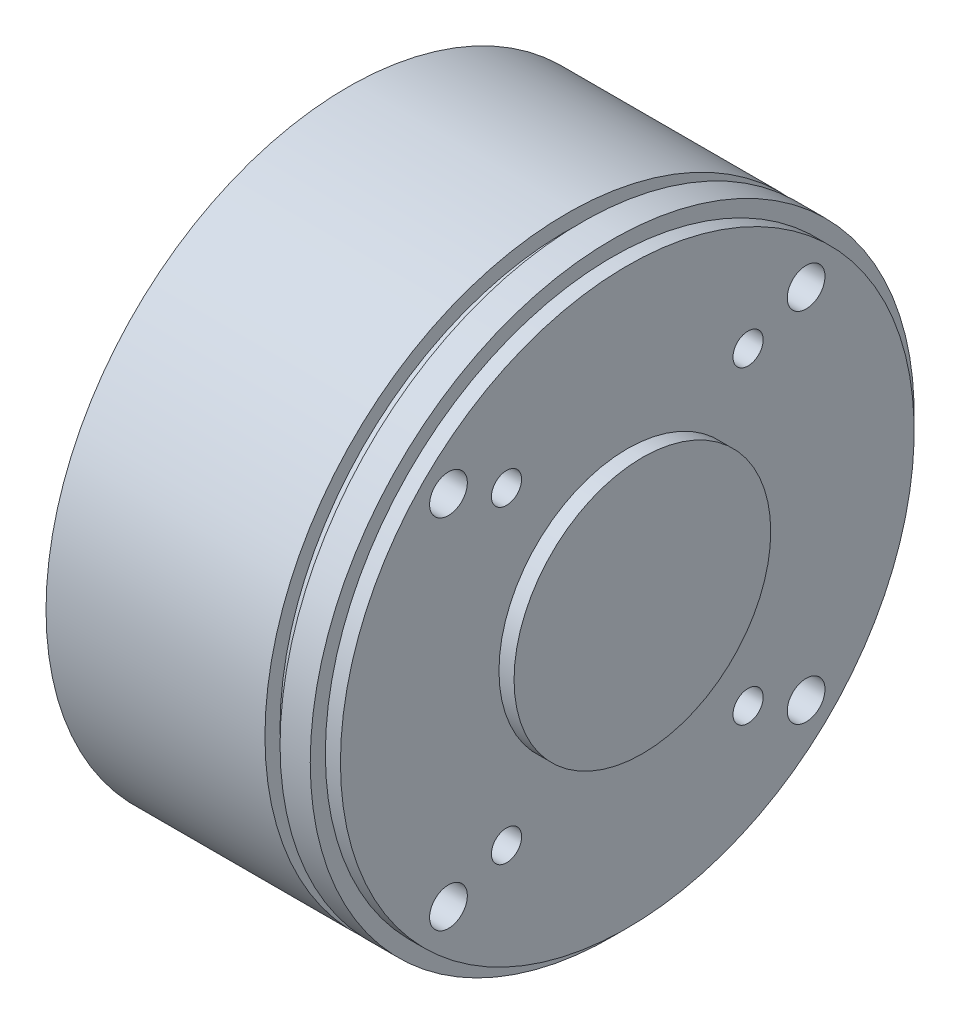
ISO-10303-21;
HEADER;
FILE_DESCRIPTION(('STEP AP214'),'2;1');
FILE_NAME('part.step','',(''),(''),'','','');
FILE_SCHEMA(('AUTOMOTIVE_DESIGN { 1 0 10303 214 1 1 1 1 }'));
ENDSEC;
DATA;
#1=APPLICATION_CONTEXT('core data for automotive mechanical design processes');
#2=APPLICATION_PROTOCOL_DEFINITION('international standard','automotive_design',2000,#1);
#3=PRODUCT_CONTEXT('',#1,'mechanical');
#4=PRODUCT('Part','Part','',(#3));
#5=PRODUCT_RELATED_PRODUCT_CATEGORY('part','',(#4));
#6=PRODUCT_DEFINITION_FORMATION('','',#4);
#7=PRODUCT_DEFINITION_CONTEXT('part definition',#1,'design');
#8=PRODUCT_DEFINITION('design','',#6,#7);
#9=PRODUCT_DEFINITION_SHAPE('','',#8);
#10=(LENGTH_UNIT() NAMED_UNIT(*) SI_UNIT(.MILLI.,.METRE.));
#11=(NAMED_UNIT(*) PLANE_ANGLE_UNIT() SI_UNIT($,.RADIAN.));
#12=(NAMED_UNIT(*) SI_UNIT($,.STERADIAN.) SOLID_ANGLE_UNIT());
#13=UNCERTAINTY_MEASURE_WITH_UNIT(LENGTH_MEASURE(1.E-05),#10,'distance_accuracy_value','');
#14=(GEOMETRIC_REPRESENTATION_CONTEXT(3) GLOBAL_UNCERTAINTY_ASSIGNED_CONTEXT((#13)) GLOBAL_UNIT_ASSIGNED_CONTEXT((#10,
#11,#12)) REPRESENTATION_CONTEXT('',''));
#15=CARTESIAN_POINT('',(0.,0.,0.));
#16=DIRECTION('',(0.,0.,1.));
#17=DIRECTION('',(1.,0.,0.));
#18=AXIS2_PLACEMENT_3D('',#15,#16,#17);
#19=CARTESIAN_POINT('',(-15.,0.,-15.));
#20=DIRECTION('',(1.,0.,0.));
#21=DIRECTION('',(0.,0.,-1.));
#22=AXIS2_PLACEMENT_3D('',#19,#20,#21);
#23=PLANE('',#22);
#24=CARTESIAN_POINT('',(-15.,10.,0.));
#25=DIRECTION('',(-1.,0.,0.));
#26=DIRECTION('',(0.,0.,1.));
#27=AXIS2_PLACEMENT_3D('',#24,#25,#26);
#28=CIRCLE('',#27,1.5);
#29=CARTESIAN_POINT('',(-15.,10.,1.5));
#30=VERTEX_POINT('',#29);
#31=EDGE_CURVE('E192',#30,#30,#28,.T.);
#32=ORIENTED_EDGE('',*,*,#31,.F.);
#33=EDGE_LOOP('',(#32));
#34=FACE_BOUND('',#33,.T.);
#35=CARTESIAN_POINT('',(-15.,0.,10.));
#36=DIRECTION('',(-1.,0.,0.));
#37=DIRECTION('',(0.,0.,1.));
#38=AXIS2_PLACEMENT_3D('',#35,#36,#37);
#39=CIRCLE('',#38,1.5);
#40=CARTESIAN_POINT('',(-15.,0.,11.5));
#41=VERTEX_POINT('',#40);
#42=EDGE_CURVE('E196',#41,#41,#39,.T.);
#43=ORIENTED_EDGE('',*,*,#42,.F.);
#44=EDGE_LOOP('',(#43));
#45=FACE_BOUND('',#44,.T.);
#46=CARTESIAN_POINT('',(-15.,-10.,5.66321487883075E-13));
#47=DIRECTION('',(-1.,0.,0.));
#48=DIRECTION('',(0.,0.,1.));
#49=AXIS2_PLACEMENT_3D('',#46,#47,#48);
#50=CIRCLE('',#49,1.50000000000061);
#51=CARTESIAN_POINT('',(-15.,-10.,1.50000000000118));
#52=VERTEX_POINT('',#51);
#53=EDGE_CURVE('E84',#52,#52,#50,.T.);
#54=ORIENTED_EDGE('',*,*,#53,.F.);
#55=EDGE_LOOP('',(#54));
#56=FACE_BOUND('',#55,.T.);
#57=CARTESIAN_POINT('',(-15.,1.06305679837731E-13,-10.));
#58=DIRECTION('',(-1.,0.,0.));
#59=DIRECTION('',(0.,0.,1.));
#60=AXIS2_PLACEMENT_3D('',#57,#58,#59);
#61=CIRCLE('',#60,1.5);
#62=CARTESIAN_POINT('',(-15.,1.06305679837731E-13,-8.5));
#63=VERTEX_POINT('',#62);
#64=EDGE_CURVE('E75',#63,#63,#61,.T.);
#65=ORIENTED_EDGE('',*,*,#64,.F.);
#66=EDGE_LOOP('',(#65));
#67=FACE_BOUND('',#66,.T.);
#68=CARTESIAN_POINT('',(-15.,0.,0.));
#69=DIRECTION('',(-1.,0.,0.));
#70=DIRECTION('',(0.,0.,1.));
#71=AXIS2_PLACEMENT_3D('',#68,#69,#70);
#72=CIRCLE('',#71,15.);
#73=CARTESIAN_POINT('',(-15.,0.,15.));
#74=VERTEX_POINT('',#73);
#75=EDGE_CURVE('E43',#74,#74,#72,.T.);
#76=ORIENTED_EDGE('',*,*,#75,.T.);
#77=EDGE_LOOP('',(#76));
#78=FACE_BOUND('',#77,.T.);
#79=ADVANCED_FACE('F34',(#34,#45,#56,#67,#78),#23,.F.);
#80=CARTESIAN_POINT('',(-14.5,0.,-20.));
#81=DIRECTION('',(1.,0.,0.));
#82=DIRECTION('',(0.,0.,-1.));
#83=AXIS2_PLACEMENT_3D('',#80,#81,#82);
#84=PLANE('',#83);
#85=CARTESIAN_POINT('',(-14.5,0.,0.));
#86=DIRECTION('',(1.,0.,0.));
#87=DIRECTION('',(0.,0.,-1.));
#88=AXIS2_PLACEMENT_3D('',#85,#86,#87);
#89=CIRCLE('',#88,15.5);
#90=CARTESIAN_POINT('',(-14.5,0.,-15.5));
#91=VERTEX_POINT('',#90);
#92=EDGE_CURVE('E10',#91,#91,#89,.T.);
#93=ORIENTED_EDGE('',*,*,#92,.T.);
#94=EDGE_LOOP('',(#93));
#95=FACE_BOUND('',#94,.T.);
#96=CARTESIAN_POINT('',(-14.5,0.,0.));
#97=DIRECTION('',(-1.,0.,0.));
#98=DIRECTION('',(0.,0.,1.));
#99=AXIS2_PLACEMENT_3D('',#96,#97,#98);
#100=CIRCLE('',#99,20.);
#101=CARTESIAN_POINT('',(-14.5,0.,20.));
#102=VERTEX_POINT('',#101);
#103=EDGE_CURVE('E48',#102,#102,#100,.T.);
#104=ORIENTED_EDGE('',*,*,#103,.T.);
#105=EDGE_LOOP('',(#104));
#106=FACE_BOUND('',#105,.T.);
#107=ADVANCED_FACE('F118',(#95,#106),#84,.F.);
#108=CARTESIAN_POINT('',(-9.64640688418887,0.,0.));
#109=DIRECTION('',(-1.,0.,0.));
#110=DIRECTION('',(0.,0.,1.));
#111=AXIS2_PLACEMENT_3D('',#108,#109,#110);
#112=CYLINDRICAL_SURFACE('',#111,20.);
#113=ORIENTED_EDGE('',*,*,#103,.F.);
#114=EDGE_LOOP('',(#113));
#115=FACE_BOUND('',#114,.T.);
#116=CARTESIAN_POINT('',(0.,0.,0.));
#117=DIRECTION('',(-1.,0.,0.));
#118=DIRECTION('',(0.,0.,1.));
#119=AXIS2_PLACEMENT_3D('',#116,#117,#118);
#120=CIRCLE('',#119,20.);
#121=CARTESIAN_POINT('',(0.,0.,20.));
#122=VERTEX_POINT('',#121);
#123=EDGE_CURVE('E113',#122,#122,#120,.T.);
#124=ORIENTED_EDGE('',*,*,#123,.T.);
#125=EDGE_LOOP('',(#124));
#126=FACE_BOUND('',#125,.T.);
#127=ADVANCED_FACE('F120',(#115,#126),#112,.T.);
#128=CARTESIAN_POINT('',(0.,0.,-19.));
#129=DIRECTION('',(-1.,0.,0.));
#130=DIRECTION('',(0.,0.,1.));
#131=AXIS2_PLACEMENT_3D('',#128,#129,#130);
#132=PLANE('',#131);
#133=ORIENTED_EDGE('',*,*,#123,.F.);
#134=EDGE_LOOP('',(#133));
#135=FACE_BOUND('',#134,.T.);
#136=CARTESIAN_POINT('',(0.,0.,0.));
#137=DIRECTION('',(-1.,0.,0.));
#138=DIRECTION('',(0.,0.,1.));
#139=AXIS2_PLACEMENT_3D('',#136,#137,#138);
#140=CIRCLE('',#139,19.);
#141=CARTESIAN_POINT('',(0.,0.,19.));
#142=VERTEX_POINT('',#141);
#143=EDGE_CURVE('E110',#142,#142,#140,.T.);
#144=ORIENTED_EDGE('',*,*,#143,.T.);
#145=EDGE_LOOP('',(#144));
#146=FACE_BOUND('',#145,.T.);
#147=ADVANCED_FACE('F123',(#135,#146),#132,.F.);
#148=CARTESIAN_POINT('',(-9.64640688418887,0.,0.));
#149=DIRECTION('',(-1.,0.,0.));
#150=DIRECTION('',(0.,0.,1.));
#151=AXIS2_PLACEMENT_3D('',#148,#149,#150);
#152=CYLINDRICAL_SURFACE('',#151,19.);
#153=ORIENTED_EDGE('',*,*,#143,.F.);
#154=EDGE_LOOP('',(#153));
#155=FACE_BOUND('',#154,.T.);
#156=CARTESIAN_POINT('',(0.999999999999999,0.,0.));
#157=DIRECTION('',(-1.,0.,0.));
#158=DIRECTION('',(0.,0.,1.));
#159=AXIS2_PLACEMENT_3D('',#156,#157,#158);
#160=CIRCLE('',#159,19.);
#161=CARTESIAN_POINT('',(0.999999999999999,0.,19.));
#162=VERTEX_POINT('',#161);
#163=EDGE_CURVE('E107',#162,#162,#160,.T.);
#164=ORIENTED_EDGE('',*,*,#163,.T.);
#165=EDGE_LOOP('',(#164));
#166=FACE_BOUND('',#165,.T.);
#167=ADVANCED_FACE('F129',(#155,#166),#152,.T.);
#168=CARTESIAN_POINT('',(1.,0.,-19.));
#169=DIRECTION('',(1.,0.,0.));
#170=DIRECTION('',(0.,0.,-1.));
#171=AXIS2_PLACEMENT_3D('',#168,#169,#170);
#172=PLANE('',#171);
#173=ORIENTED_EDGE('',*,*,#163,.F.);
#174=EDGE_LOOP('',(#173));
#175=FACE_BOUND('',#174,.T.);
#176=CARTESIAN_POINT('',(0.999999999999999,0.,0.));
#177=DIRECTION('',(-1.,0.,0.));
#178=DIRECTION('',(0.,0.,1.));
#179=AXIS2_PLACEMENT_3D('',#176,#177,#178);
#180=CIRCLE('',#179,20.);
#181=CARTESIAN_POINT('',(0.999999999999999,0.,20.));
#182=VERTEX_POINT('',#181);
#183=EDGE_CURVE('E104',#182,#182,#180,.T.);
#184=ORIENTED_EDGE('',*,*,#183,.T.);
#185=EDGE_LOOP('',(#184));
#186=FACE_BOUND('',#185,.T.);
#187=ADVANCED_FACE('F135',(#175,#186),#172,.F.);
#188=CARTESIAN_POINT('',(-9.64640688418887,0.,0.));
#189=DIRECTION('',(-1.,0.,0.));
#190=DIRECTION('',(0.,0.,1.));
#191=AXIS2_PLACEMENT_3D('',#188,#189,#190);
#192=CYLINDRICAL_SURFACE('',#191,20.);
#193=ORIENTED_EDGE('',*,*,#183,.F.);
#194=EDGE_LOOP('',(#193));
#195=FACE_BOUND('',#194,.T.);
#196=CARTESIAN_POINT('',(3.,0.,0.));
#197=DIRECTION('',(-1.,0.,0.));
#198=DIRECTION('',(0.,0.,1.));
#199=AXIS2_PLACEMENT_3D('',#196,#197,#198);
#200=CIRCLE('',#199,20.);
#201=CARTESIAN_POINT('',(3.,0.,20.));
#202=VERTEX_POINT('',#201);
#203=EDGE_CURVE('E101',#202,#202,#200,.T.);
#204=ORIENTED_EDGE('',*,*,#203,.T.);
#205=EDGE_LOOP('',(#204));
#206=FACE_BOUND('',#205,.T.);
#207=ADVANCED_FACE('F141',(#195,#206),#192,.T.);
#208=CARTESIAN_POINT('',(3.,0.,-20.));
#209=DIRECTION('',(-1.,0.,0.));
#210=DIRECTION('',(0.,0.,1.));
#211=AXIS2_PLACEMENT_3D('',#208,#209,#210);
#212=PLANE('',#211);
#213=ORIENTED_EDGE('',*,*,#203,.F.);
#214=EDGE_LOOP('',(#213));
#215=FACE_BOUND('',#214,.T.);
#216=CARTESIAN_POINT('',(3.,0.,0.));
#217=DIRECTION('',(-1.,0.,0.));
#218=DIRECTION('',(0.,0.,1.));
#219=AXIS2_PLACEMENT_3D('',#216,#217,#218);
#220=CIRCLE('',#219,19.);
#221=CARTESIAN_POINT('',(3.,0.,19.));
#222=VERTEX_POINT('',#221);
#223=EDGE_CURVE('E98',#222,#222,#220,.T.);
#224=ORIENTED_EDGE('',*,*,#223,.T.);
#225=EDGE_LOOP('',(#224));
#226=FACE_BOUND('',#225,.T.);
#227=ADVANCED_FACE('F147',(#215,#226),#212,.F.);
#228=CARTESIAN_POINT('',(-9.64640688418887,0.,0.));
#229=DIRECTION('',(-1.,0.,0.));
#230=DIRECTION('',(0.,0.,1.));
#231=AXIS2_PLACEMENT_3D('',#228,#229,#230);
#232=CYLINDRICAL_SURFACE('',#231,19.);
#233=ORIENTED_EDGE('',*,*,#223,.F.);
#234=EDGE_LOOP('',(#233));
#235=FACE_BOUND('',#234,.T.);
#236=CARTESIAN_POINT('',(4.,0.,0.));
#237=DIRECTION('',(-1.,0.,0.));
#238=DIRECTION('',(0.,0.,1.));
#239=AXIS2_PLACEMENT_3D('',#236,#237,#238);
#240=CIRCLE('',#239,19.);
#241=CARTESIAN_POINT('',(4.,0.,19.));
#242=VERTEX_POINT('',#241);
#243=EDGE_CURVE('E95',#242,#242,#240,.T.);
#244=ORIENTED_EDGE('',*,*,#243,.T.);
#245=EDGE_LOOP('',(#244));
#246=FACE_BOUND('',#245,.T.);
#247=ADVANCED_FACE('F153',(#235,#246),#232,.T.);
#248=CARTESIAN_POINT('',(4.,0.,-19.));
#249=DIRECTION('',(-1.,0.,0.));
#250=DIRECTION('',(0.,0.,1.));
#251=AXIS2_PLACEMENT_3D('',#248,#249,#250);
#252=PLANE('',#251);
#253=CARTESIAN_POINT('',(4.,10.25,-8.));
#254=DIRECTION('',(-1.,0.,0.));
#255=DIRECTION('',(0.,0.,1.));
#256=AXIS2_PLACEMENT_3D('',#253,#254,#255);
#257=CIRCLE('',#256,1.);
#258=CARTESIAN_POINT('',(4.,10.25,-7.));
#259=VERTEX_POINT('',#258);
#260=EDGE_CURVE('E39',#259,#259,#257,.T.);
#261=ORIENTED_EDGE('',*,*,#260,.T.);
#262=EDGE_LOOP('',(#261));
#263=FACE_BOUND('',#262,.T.);
#264=CARTESIAN_POINT('',(4.,-10.25,-8.00000000000001));
#265=DIRECTION('',(-1.,0.,0.));
#266=DIRECTION('',(0.,0.,1.));
#267=AXIS2_PLACEMENT_3D('',#264,#265,#266);
#268=CIRCLE('',#267,1.);
#269=CARTESIAN_POINT('',(4.,-10.25,-7.));
#270=VERTEX_POINT('',#269);
#271=EDGE_CURVE('E70',#270,#270,#268,.T.);
#272=ORIENTED_EDGE('',*,*,#271,.T.);
#273=EDGE_LOOP('',(#272));
#274=FACE_BOUND('',#273,.T.);
#275=CARTESIAN_POINT('',(4.,-10.25,8.));
#276=DIRECTION('',(-1.,0.,0.));
#277=DIRECTION('',(0.,0.,1.));
#278=AXIS2_PLACEMENT_3D('',#275,#276,#277);
#279=CIRCLE('',#278,1.);
#280=CARTESIAN_POINT('',(4.,-10.25,9.));
#281=VERTEX_POINT('',#280);
#282=EDGE_CURVE('E68',#281,#281,#279,.T.);
#283=ORIENTED_EDGE('',*,*,#282,.T.);
#284=EDGE_LOOP('',(#283));
#285=FACE_BOUND('',#284,.T.);
#286=CARTESIAN_POINT('',(4.,11.8440385848746,11.8440385848747));
#287=DIRECTION('',(-1.,0.,0.));
#288=DIRECTION('',(0.,0.,1.));
#289=AXIS2_PLACEMENT_3D('',#286,#287,#288);
#290=CIRCLE('',#289,1.25);
#291=CARTESIAN_POINT('',(4.,11.8440385848746,13.0940385848747));
#292=VERTEX_POINT('',#291);
#293=EDGE_CURVE('E65',#292,#292,#290,.T.);
#294=ORIENTED_EDGE('',*,*,#293,.T.);
#295=EDGE_LOOP('',(#294));
#296=FACE_BOUND('',#295,.T.);
#297=CARTESIAN_POINT('',(4.,11.8440385848754,-11.8440385848746));
#298=DIRECTION('',(-1.,0.,0.));
#299=DIRECTION('',(0.,0.,1.));
#300=AXIS2_PLACEMENT_3D('',#297,#298,#299);
#301=CIRCLE('',#300,1.25000000000068);
#302=CARTESIAN_POINT('',(4.,11.8440385848754,-10.5940385848739));
#303=VERTEX_POINT('',#302);
#304=EDGE_CURVE('E62',#303,#303,#301,.T.);
#305=ORIENTED_EDGE('',*,*,#304,.T.);
#306=EDGE_LOOP('',(#305));
#307=FACE_BOUND('',#306,.T.);
#308=CARTESIAN_POINT('',(4.,-11.8440385848739,-11.8440385848754));
#309=DIRECTION('',(-1.,0.,0.));
#310=DIRECTION('',(0.,0.,1.));
#311=AXIS2_PLACEMENT_3D('',#308,#309,#310);
#312=CIRCLE('',#311,1.25000000000093);
#313=CARTESIAN_POINT('',(4.,-11.8440385848739,-10.5940385848745));
#314=VERTEX_POINT('',#313);
#315=EDGE_CURVE('E59',#314,#314,#312,.T.);
#316=ORIENTED_EDGE('',*,*,#315,.T.);
#317=EDGE_LOOP('',(#316));
#318=FACE_BOUND('',#317,.T.);
#319=CARTESIAN_POINT('',(4.,-11.8440385848747,11.8440385848739));
#320=DIRECTION('',(-1.,0.,0.));
#321=DIRECTION('',(0.,0.,1.));
#322=AXIS2_PLACEMENT_3D('',#319,#320,#321);
#323=CIRCLE('',#322,1.25000000000035);
#324=CARTESIAN_POINT('',(4.,-11.8440385848747,13.0940385848743));
#325=VERTEX_POINT('',#324);
#326=EDGE_CURVE('E55',#325,#325,#323,.T.);
#327=ORIENTED_EDGE('',*,*,#326,.T.);
#328=EDGE_LOOP('',(#327));
#329=FACE_BOUND('',#328,.T.);
#330=CARTESIAN_POINT('',(4.,10.25,8.));
#331=DIRECTION('',(-1.,0.,0.));
#332=DIRECTION('',(0.,0.,1.));
#333=AXIS2_PLACEMENT_3D('',#330,#331,#332);
#334=CIRCLE('',#333,1.);
#335=CARTESIAN_POINT('',(4.,10.25,9.));
#336=VERTEX_POINT('',#335);
#337=EDGE_CURVE('E52',#336,#336,#334,.T.);
#338=ORIENTED_EDGE('',*,*,#337,.T.);
#339=EDGE_LOOP('',(#338));
#340=FACE_BOUND('',#339,.T.);
#341=ORIENTED_EDGE('',*,*,#243,.F.);
#342=EDGE_LOOP('',(#341));
#343=FACE_BOUND('',#342,.T.);
#344=CARTESIAN_POINT('',(4.,0.,0.));
#345=DIRECTION('',(-1.,0.,0.));
#346=DIRECTION('',(0.,0.,1.));
#347=AXIS2_PLACEMENT_3D('',#344,#345,#346);
#348=CIRCLE('',#347,8.5);
#349=CARTESIAN_POINT('',(4.,0.,8.5));
#350=VERTEX_POINT('',#349);
#351=EDGE_CURVE('E91',#350,#350,#348,.T.);
#352=ORIENTED_EDGE('',*,*,#351,.T.);
#353=EDGE_LOOP('',(#352));
#354=FACE_BOUND('',#353,.T.);
#355=ADVANCED_FACE('F159',(#263,#274,#285,#296,#307,#318,#329,#340,#343,#354),#252,.F.);
#356=CARTESIAN_POINT('',(-9.64640688418887,0.,0.));
#357=DIRECTION('',(-1.,0.,0.));
#358=DIRECTION('',(0.,0.,1.));
#359=AXIS2_PLACEMENT_3D('',#356,#357,#358);
#360=CYLINDRICAL_SURFACE('',#359,8.5);
#361=ORIENTED_EDGE('',*,*,#351,.F.);
#362=EDGE_LOOP('',(#361));
#363=FACE_BOUND('',#362,.T.);
#364=CARTESIAN_POINT('',(5.,0.,0.));
#365=DIRECTION('',(-1.,0.,0.));
#366=DIRECTION('',(0.,0.,1.));
#367=AXIS2_PLACEMENT_3D('',#364,#365,#366);
#368=CIRCLE('',#367,8.5);
#369=CARTESIAN_POINT('',(5.,0.,8.5));
#370=VERTEX_POINT('',#369);
#371=EDGE_CURVE('E88',#370,#370,#368,.T.);
#372=ORIENTED_EDGE('',*,*,#371,.T.);
#373=EDGE_LOOP('',(#372));
#374=FACE_BOUND('',#373,.T.);
#375=ADVANCED_FACE('F165',(#363,#374),#360,.T.);
#376=CARTESIAN_POINT('',(5.,0.,-8.5));
#377=DIRECTION('',(-1.,0.,0.));
#378=DIRECTION('',(0.,0.,1.));
#379=AXIS2_PLACEMENT_3D('',#376,#377,#378);
#380=PLANE('',#379);
#381=ORIENTED_EDGE('',*,*,#371,.F.);
#382=EDGE_LOOP('',(#381));
#383=FACE_BOUND('',#382,.T.);
#384=ADVANCED_FACE('F171',(#383),#380,.F.);
#385=CARTESIAN_POINT('',(-15.,0.,0.));
#386=DIRECTION('',(1.,0.,0.));
#387=DIRECTION('',(0.,0.,-1.));
#388=AXIS2_PLACEMENT_3D('',#385,#386,#387);
#389=CONICAL_SURFACE('',#388,15.,0.785398163397445);
#390=ORIENTED_EDGE('',*,*,#92,.F.);
#391=EDGE_LOOP('',(#390));
#392=FACE_BOUND('',#391,.T.);
#393=ORIENTED_EDGE('',*,*,#75,.F.);
#394=EDGE_LOOP('',(#393));
#395=FACE_BOUND('',#394,.T.);
#396=ADVANCED_FACE('F37',(#392,#395),#389,.T.);
#397=CARTESIAN_POINT('',(-10.,1.06305679837731E-13,-10.));
#398=DIRECTION('',(-1.,0.,0.));
#399=DIRECTION('',(0.,0.,1.));
#400=AXIS2_PLACEMENT_3D('',#397,#398,#399);
#401=CYLINDRICAL_SURFACE('',#400,1.5);
#402=CARTESIAN_POINT('',(-10.,1.06305679837731E-13,-10.));
#403=DIRECTION('',(-1.,0.,0.));
#404=DIRECTION('',(0.,0.,1.));
#405=AXIS2_PLACEMENT_3D('',#402,#403,#404);
#406=CIRCLE('',#405,1.5);
#407=CARTESIAN_POINT('',(-10.,1.06305679837731E-13,-8.5));
#408=VERTEX_POINT('',#407);
#409=EDGE_CURVE('E79',#408,#408,#406,.T.);
#410=ORIENTED_EDGE('',*,*,#409,.F.);
#411=EDGE_LOOP('',(#410));
#412=FACE_BOUND('',#411,.T.);
#413=ORIENTED_EDGE('',*,*,#64,.T.);
#414=EDGE_LOOP('',(#413));
#415=FACE_BOUND('',#414,.T.);
#416=ADVANCED_FACE('F180',(#412,#415),#401,.F.);
#417=CARTESIAN_POINT('',(-10.,1.06305679837731E-13,-10.));
#418=DIRECTION('',(-1.,0.,0.));
#419=DIRECTION('',(0.,0.,1.));
#420=AXIS2_PLACEMENT_3D('',#417,#418,#419);
#421=PLANE('',#420);
#422=ORIENTED_EDGE('',*,*,#409,.T.);
#423=EDGE_LOOP('',(#422));
#424=FACE_BOUND('',#423,.T.);
#425=ADVANCED_FACE('F292',(#424),#421,.T.);
#426=CARTESIAN_POINT('',(-10.,-10.,5.66321487883075E-13));
#427=DIRECTION('',(-1.,0.,0.));
#428=DIRECTION('',(0.,0.,1.));
#429=AXIS2_PLACEMENT_3D('',#426,#427,#428);
#430=CYLINDRICAL_SURFACE('',#429,1.50000000000061);
#431=CARTESIAN_POINT('',(-10.,-10.,5.66321487883075E-13));
#432=DIRECTION('',(-1.,0.,0.));
#433=DIRECTION('',(0.,0.,1.));
#434=AXIS2_PLACEMENT_3D('',#431,#432,#433);
#435=CIRCLE('',#434,1.50000000000061);
#436=CARTESIAN_POINT('',(-10.,-10.,1.50000000000118));
#437=VERTEX_POINT('',#436);
#438=EDGE_CURVE('E204',#437,#437,#435,.T.);
#439=ORIENTED_EDGE('',*,*,#438,.F.);
#440=EDGE_LOOP('',(#439));
#441=FACE_BOUND('',#440,.T.);
#442=ORIENTED_EDGE('',*,*,#53,.T.);
#443=EDGE_LOOP('',(#442));
#444=FACE_BOUND('',#443,.T.);
#445=ADVANCED_FACE('F288',(#441,#444),#430,.F.);
#446=CARTESIAN_POINT('',(-10.,-10.,5.66321487883075E-13));
#447=DIRECTION('',(-1.,0.,0.));
#448=DIRECTION('',(0.,0.,1.));
#449=AXIS2_PLACEMENT_3D('',#446,#447,#448);
#450=PLANE('',#449);
#451=ORIENTED_EDGE('',*,*,#438,.T.);
#452=EDGE_LOOP('',(#451));
#453=FACE_BOUND('',#452,.T.);
#454=ADVANCED_FACE('F284',(#453),#450,.T.);
#455=CARTESIAN_POINT('',(-10.,0.,10.));
#456=DIRECTION('',(-1.,0.,0.));
#457=DIRECTION('',(0.,0.,1.));
#458=AXIS2_PLACEMENT_3D('',#455,#456,#457);
#459=CYLINDRICAL_SURFACE('',#458,1.5);
#460=CARTESIAN_POINT('',(-10.,0.,10.));
#461=DIRECTION('',(-1.,0.,0.));
#462=DIRECTION('',(0.,0.,1.));
#463=AXIS2_PLACEMENT_3D('',#460,#461,#462);
#464=CIRCLE('',#463,1.5);
#465=CARTESIAN_POINT('',(-10.,0.,11.5));
#466=VERTEX_POINT('',#465);
#467=EDGE_CURVE('E209',#466,#466,#464,.T.);
#468=ORIENTED_EDGE('',*,*,#467,.F.);
#469=EDGE_LOOP('',(#468));
#470=FACE_BOUND('',#469,.T.);
#471=ORIENTED_EDGE('',*,*,#42,.T.);
#472=EDGE_LOOP('',(#471));
#473=FACE_BOUND('',#472,.T.);
#474=ADVANCED_FACE('F280',(#470,#473),#459,.F.);
#475=CARTESIAN_POINT('',(-10.,0.,10.));
#476=DIRECTION('',(-1.,0.,0.));
#477=DIRECTION('',(0.,0.,1.));
#478=AXIS2_PLACEMENT_3D('',#475,#476,#477);
#479=PLANE('',#478);
#480=ORIENTED_EDGE('',*,*,#467,.T.);
#481=EDGE_LOOP('',(#480));
#482=FACE_BOUND('',#481,.T.);
#483=ADVANCED_FACE('F276',(#482),#479,.T.);
#484=CARTESIAN_POINT('',(-10.,10.,0.));
#485=DIRECTION('',(-1.,0.,0.));
#486=DIRECTION('',(0.,0.,1.));
#487=AXIS2_PLACEMENT_3D('',#484,#485,#486);
#488=CYLINDRICAL_SURFACE('',#487,1.5);
#489=CARTESIAN_POINT('',(-10.,10.,0.));
#490=DIRECTION('',(-1.,0.,0.));
#491=DIRECTION('',(0.,0.,1.));
#492=AXIS2_PLACEMENT_3D('',#489,#490,#491);
#493=CIRCLE('',#492,1.5);
#494=CARTESIAN_POINT('',(-10.,10.,1.5));
#495=VERTEX_POINT('',#494);
#496=EDGE_CURVE('E92',#495,#495,#493,.T.);
#497=ORIENTED_EDGE('',*,*,#496,.F.);
#498=EDGE_LOOP('',(#497));
#499=FACE_BOUND('',#498,.T.);
#500=ORIENTED_EDGE('',*,*,#31,.T.);
#501=EDGE_LOOP('',(#500));
#502=FACE_BOUND('',#501,.T.);
#503=ADVANCED_FACE('F268',(#499,#502),#488,.F.);
#504=CARTESIAN_POINT('',(-10.,10.,0.));
#505=DIRECTION('',(-1.,0.,0.));
#506=DIRECTION('',(0.,0.,1.));
#507=AXIS2_PLACEMENT_3D('',#504,#505,#506);
#508=PLANE('',#507);
#509=ORIENTED_EDGE('',*,*,#496,.T.);
#510=EDGE_LOOP('',(#509));
#511=FACE_BOUND('',#510,.T.);
#512=ADVANCED_FACE('F258',(#511),#508,.T.);
#513=CARTESIAN_POINT('',(0.,10.25,8.));
#514=DIRECTION('',(1.,0.,0.));
#515=DIRECTION('',(0.,0.,-1.));
#516=AXIS2_PLACEMENT_3D('',#513,#514,#515);
#517=CYLINDRICAL_SURFACE('',#516,1.);
#518=CARTESIAN_POINT('',(0.,10.25,8.));
#519=DIRECTION('',(1.,0.,0.));
#520=DIRECTION('',(0.,0.,-1.));
#521=AXIS2_PLACEMENT_3D('',#518,#519,#520);
#522=CIRCLE('',#521,1.);
#523=CARTESIAN_POINT('',(0.,10.25,7.));
#524=VERTEX_POINT('',#523);
#525=EDGE_CURVE('E56',#524,#524,#522,.T.);
#526=ORIENTED_EDGE('',*,*,#525,.F.);
#527=EDGE_LOOP('',(#526));
#528=FACE_BOUND('',#527,.T.);
#529=ORIENTED_EDGE('',*,*,#337,.F.);
#530=EDGE_LOOP('',(#529));
#531=FACE_BOUND('',#530,.T.);
#532=ADVANCED_FACE('F255',(#528,#531),#517,.F.);
#533=CARTESIAN_POINT('',(0.,10.25,8.));
#534=DIRECTION('',(1.,0.,0.));
#535=DIRECTION('',(0.,0.,-1.));
#536=AXIS2_PLACEMENT_3D('',#533,#534,#535);
#537=PLANE('',#536);
#538=ORIENTED_EDGE('',*,*,#525,.T.);
#539=EDGE_LOOP('',(#538));
#540=FACE_BOUND('',#539,.T.);
#541=ADVANCED_FACE('F257',(#540),#537,.T.);
#542=CARTESIAN_POINT('',(0.,-11.8440385848747,11.8440385848739));
#543=DIRECTION('',(1.,0.,0.));
#544=DIRECTION('',(0.,0.,-1.));
#545=AXIS2_PLACEMENT_3D('',#542,#543,#544);
#546=CYLINDRICAL_SURFACE('',#545,1.25000000000035);
#547=CARTESIAN_POINT('',(0.,-11.8440385848747,11.8440385848739));
#548=DIRECTION('',(1.,0.,0.));
#549=DIRECTION('',(0.,0.,-1.));
#550=AXIS2_PLACEMENT_3D('',#547,#548,#549);
#551=CIRCLE('',#550,1.25000000000035);
#552=CARTESIAN_POINT('',(0.,-11.8440385848747,10.5940385848736));
#553=VERTEX_POINT('',#552);
#554=EDGE_CURVE('E230',#553,#553,#551,.T.);
#555=ORIENTED_EDGE('',*,*,#554,.F.);
#556=EDGE_LOOP('',(#555));
#557=FACE_BOUND('',#556,.T.);
#558=ORIENTED_EDGE('',*,*,#326,.F.);
#559=EDGE_LOOP('',(#558));
#560=FACE_BOUND('',#559,.T.);
#561=ADVANCED_FACE('F265',(#557,#560),#546,.F.);
#562=CARTESIAN_POINT('',(0.,-11.8440385848747,11.8440385848739));
#563=DIRECTION('',(1.,0.,0.));
#564=DIRECTION('',(0.,0.,-1.));
#565=AXIS2_PLACEMENT_3D('',#562,#563,#564);
#566=PLANE('',#565);
#567=ORIENTED_EDGE('',*,*,#554,.T.);
#568=EDGE_LOOP('',(#567));
#569=FACE_BOUND('',#568,.T.);
#570=ADVANCED_FACE('F358',(#569),#566,.T.);
#571=CARTESIAN_POINT('',(0.,-11.8440385848739,-11.8440385848754));
#572=DIRECTION('',(1.,0.,0.));
#573=DIRECTION('',(0.,0.,-1.));
#574=AXIS2_PLACEMENT_3D('',#571,#572,#573);
#575=CYLINDRICAL_SURFACE('',#574,1.25000000000093);
#576=CARTESIAN_POINT('',(0.,-11.8440385848739,-11.8440385848754));
#577=DIRECTION('',(1.,0.,0.));
#578=DIRECTION('',(0.,0.,-1.));
#579=AXIS2_PLACEMENT_3D('',#576,#577,#578);
#580=CIRCLE('',#579,1.25000000000093);
#581=CARTESIAN_POINT('',(0.,-11.8440385848739,-13.0940385848763));
#582=VERTEX_POINT('',#581);
#583=EDGE_CURVE('E233',#582,#582,#580,.T.);
#584=ORIENTED_EDGE('',*,*,#583,.F.);
#585=EDGE_LOOP('',(#584));
#586=FACE_BOUND('',#585,.T.);
#587=ORIENTED_EDGE('',*,*,#315,.F.);
#588=EDGE_LOOP('',(#587));
#589=FACE_BOUND('',#588,.T.);
#590=ADVANCED_FACE('F368',(#586,#589),#575,.F.);
#591=CARTESIAN_POINT('',(0.,-11.8440385848739,-11.8440385848754));
#592=DIRECTION('',(1.,0.,0.));
#593=DIRECTION('',(0.,0.,-1.));
#594=AXIS2_PLACEMENT_3D('',#591,#592,#593);
#595=PLANE('',#594);
#596=ORIENTED_EDGE('',*,*,#583,.T.);
#597=EDGE_LOOP('',(#596));
#598=FACE_BOUND('',#597,.T.);
#599=ADVANCED_FACE('F244',(#598),#595,.T.);
#600=CARTESIAN_POINT('',(0.,11.8440385848754,-11.8440385848746));
#601=DIRECTION('',(1.,0.,0.));
#602=DIRECTION('',(0.,0.,-1.));
#603=AXIS2_PLACEMENT_3D('',#600,#601,#602);
#604=CYLINDRICAL_SURFACE('',#603,1.25000000000068);
#605=CARTESIAN_POINT('',(0.,11.8440385848754,-11.8440385848746));
#606=DIRECTION('',(1.,0.,0.));
#607=DIRECTION('',(0.,0.,-1.));
#608=AXIS2_PLACEMENT_3D('',#605,#606,#607);
#609=CIRCLE('',#608,1.25000000000068);
#610=CARTESIAN_POINT('',(0.,11.8440385848754,-13.0940385848753));
#611=VERTEX_POINT('',#610);
#612=EDGE_CURVE('E222',#611,#611,#609,.T.);
#613=ORIENTED_EDGE('',*,*,#612,.F.);
#614=EDGE_LOOP('',(#613));
#615=FACE_BOUND('',#614,.T.);
#616=ORIENTED_EDGE('',*,*,#304,.F.);
#617=EDGE_LOOP('',(#616));
#618=FACE_BOUND('',#617,.T.);
#619=ADVANCED_FACE('F241',(#615,#618),#604,.F.);
#620=CARTESIAN_POINT('',(0.,11.8440385848754,-11.8440385848746));
#621=DIRECTION('',(1.,0.,0.));
#622=DIRECTION('',(0.,0.,-1.));
#623=AXIS2_PLACEMENT_3D('',#620,#621,#622);
#624=PLANE('',#623);
#625=ORIENTED_EDGE('',*,*,#612,.T.);
#626=EDGE_LOOP('',(#625));
#627=FACE_BOUND('',#626,.T.);
#628=ADVANCED_FACE('F239',(#627),#624,.T.);
#629=CARTESIAN_POINT('',(0.,11.8440385848746,11.8440385848747));
#630=DIRECTION('',(1.,0.,0.));
#631=DIRECTION('',(0.,0.,-1.));
#632=AXIS2_PLACEMENT_3D('',#629,#630,#631);
#633=CYLINDRICAL_SURFACE('',#632,1.25);
#634=CARTESIAN_POINT('',(0.,11.8440385848746,11.8440385848747));
#635=DIRECTION('',(1.,0.,0.));
#636=DIRECTION('',(0.,0.,-1.));
#637=AXIS2_PLACEMENT_3D('',#634,#635,#636);
#638=CIRCLE('',#637,1.25);
#639=CARTESIAN_POINT('',(0.,11.8440385848746,10.5940385848747));
#640=VERTEX_POINT('',#639);
#641=EDGE_CURVE('E218',#640,#640,#638,.T.);
#642=ORIENTED_EDGE('',*,*,#641,.F.);
#643=EDGE_LOOP('',(#642));
#644=FACE_BOUND('',#643,.T.);
#645=ORIENTED_EDGE('',*,*,#293,.F.);
#646=EDGE_LOOP('',(#645));
#647=FACE_BOUND('',#646,.T.);
#648=ADVANCED_FACE('F402',(#644,#647),#633,.F.);
#649=CARTESIAN_POINT('',(0.,11.8440385848746,11.8440385848747));
#650=DIRECTION('',(1.,0.,0.));
#651=DIRECTION('',(0.,0.,-1.));
#652=AXIS2_PLACEMENT_3D('',#649,#650,#651);
#653=PLANE('',#652);
#654=ORIENTED_EDGE('',*,*,#641,.T.);
#655=EDGE_LOOP('',(#654));
#656=FACE_BOUND('',#655,.T.);
#657=ADVANCED_FACE('F411',(#656),#653,.T.);
#658=CARTESIAN_POINT('',(0.,-10.25,8.));
#659=DIRECTION('',(1.,0.,0.));
#660=DIRECTION('',(0.,0.,-1.));
#661=AXIS2_PLACEMENT_3D('',#658,#659,#660);
#662=CYLINDRICAL_SURFACE('',#661,1.);
#663=CARTESIAN_POINT('',(0.,-10.25,8.));
#664=DIRECTION('',(1.,0.,0.));
#665=DIRECTION('',(0.,0.,1.));
#666=AXIS2_PLACEMENT_3D('',#663,#664,#665);
#667=CIRCLE('',#666,1.);
#668=CARTESIAN_POINT('',(0.,-10.25,9.));
#669=VERTEX_POINT('',#668);
#670=EDGE_CURVE('E221',#669,#669,#667,.T.);
#671=ORIENTED_EDGE('',*,*,#670,.F.);
#672=EDGE_LOOP('',(#671));
#673=FACE_BOUND('',#672,.T.);
#674=ORIENTED_EDGE('',*,*,#282,.F.);
#675=EDGE_LOOP('',(#674));
#676=FACE_BOUND('',#675,.T.);
#677=ADVANCED_FACE('F420',(#673,#676),#662,.F.);
#678=CARTESIAN_POINT('',(0.,-10.25,8.));
#679=DIRECTION('',(-1.,0.,0.));
#680=DIRECTION('',(0.,0.,1.));
#681=AXIS2_PLACEMENT_3D('',#678,#679,#680);
#682=PLANE('',#681);
#683=ORIENTED_EDGE('',*,*,#670,.T.);
#684=EDGE_LOOP('',(#683));
#685=FACE_BOUND('',#684,.T.);
#686=ADVANCED_FACE('F430',(#685),#682,.F.);
#687=CARTESIAN_POINT('',(0.,-10.25,-8.00000000000001));
#688=DIRECTION('',(1.,0.,0.));
#689=DIRECTION('',(0.,0.,-1.));
#690=AXIS2_PLACEMENT_3D('',#687,#688,#689);
#691=CYLINDRICAL_SURFACE('',#690,1.);
#692=CARTESIAN_POINT('',(0.,-10.25,-8.00000000000001));
#693=DIRECTION('',(1.,0.,0.));
#694=DIRECTION('',(0.,0.,-1.));
#695=AXIS2_PLACEMENT_3D('',#692,#693,#694);
#696=CIRCLE('',#695,1.);
#697=CARTESIAN_POINT('',(0.,-10.25,-9.00000000000001));
#698=VERTEX_POINT('',#697);
#699=EDGE_CURVE('E225',#698,#698,#696,.T.);
#700=ORIENTED_EDGE('',*,*,#699,.F.);
#701=EDGE_LOOP('',(#700));
#702=FACE_BOUND('',#701,.T.);
#703=ORIENTED_EDGE('',*,*,#271,.F.);
#704=EDGE_LOOP('',(#703));
#705=FACE_BOUND('',#704,.T.);
#706=ADVANCED_FACE('F440',(#702,#705),#691,.F.);
#707=CARTESIAN_POINT('',(0.,-10.25,-8.00000000000001));
#708=DIRECTION('',(1.,0.,0.));
#709=DIRECTION('',(0.,0.,-1.));
#710=AXIS2_PLACEMENT_3D('',#707,#708,#709);
#711=PLANE('',#710);
#712=ORIENTED_EDGE('',*,*,#699,.T.);
#713=EDGE_LOOP('',(#712));
#714=FACE_BOUND('',#713,.T.);
#715=ADVANCED_FACE('F450',(#714),#711,.T.);
#716=CARTESIAN_POINT('',(0.,10.25,-8.));
#717=DIRECTION('',(1.,0.,0.));
#718=DIRECTION('',(0.,0.,-1.));
#719=AXIS2_PLACEMENT_3D('',#716,#717,#718);
#720=CYLINDRICAL_SURFACE('',#719,1.);
#721=CARTESIAN_POINT('',(0.,10.25,-8.));
#722=DIRECTION('',(1.,0.,0.));
#723=DIRECTION('',(0.,0.,1.));
#724=AXIS2_PLACEMENT_3D('',#721,#722,#723);
#725=CIRCLE('',#724,1.);
#726=CARTESIAN_POINT('',(0.,10.25,-7.));
#727=VERTEX_POINT('',#726);
#728=EDGE_CURVE('E217',#727,#727,#725,.T.);
#729=ORIENTED_EDGE('',*,*,#728,.F.);
#730=EDGE_LOOP('',(#729));
#731=FACE_BOUND('',#730,.T.);
#732=ORIENTED_EDGE('',*,*,#260,.F.);
#733=EDGE_LOOP('',(#732));
#734=FACE_BOUND('',#733,.T.);
#735=ADVANCED_FACE('F460',(#731,#734),#720,.F.);
#736=CARTESIAN_POINT('',(0.,10.25,-8.));
#737=DIRECTION('',(-1.,0.,0.));
#738=DIRECTION('',(0.,0.,1.));
#739=AXIS2_PLACEMENT_3D('',#736,#737,#738);
#740=PLANE('',#739);
#741=ORIENTED_EDGE('',*,*,#728,.T.);
#742=EDGE_LOOP('',(#741));
#743=FACE_BOUND('',#742,.T.);
#744=ADVANCED_FACE('F470',(#743),#740,.F.);
#745=CLOSED_SHELL('',(#79,#107,#127,#147,#167,#187,#207,#227,#247,#355,#375,#384,#396,#416,#425,
#445,#454,#474,#483,#503,#512,#532,#541,#561,#570,#590,#599,#619,#628,#648,#657,#677,#686,#706,
#715,#735,#744));
#746=MANIFOLD_SOLID_BREP('B2',#745);
#747=ADVANCED_BREP_SHAPE_REPRESENTATION('',(#18,#746),#14);
#748=SHAPE_DEFINITION_REPRESENTATION(#9,#747);
ENDSEC;
END-ISO-10303-21;
